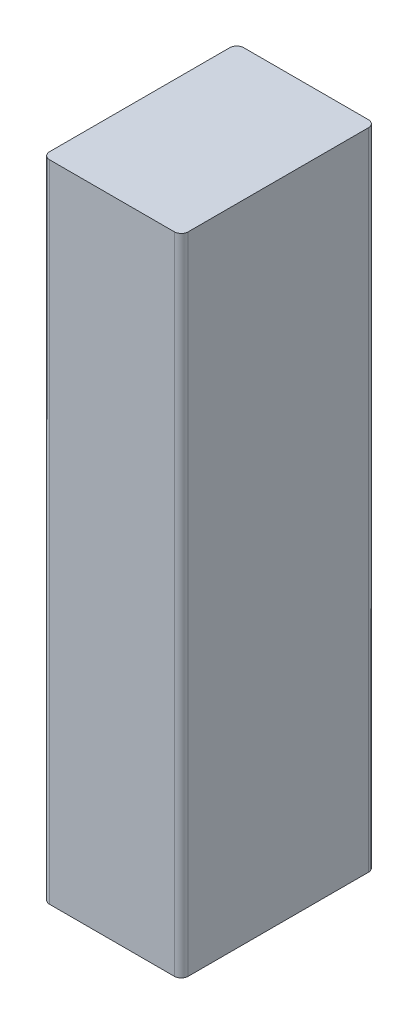
ISO-10303-21;
HEADER;
FILE_DESCRIPTION(('STEP AP214'),'2;1');
FILE_NAME('part.step','',(''),(''),'','','');
FILE_SCHEMA(('AUTOMOTIVE_DESIGN { 1 0 10303 214 1 1 1 1 }'));
ENDSEC;
DATA;
#1=APPLICATION_CONTEXT('core data for automotive mechanical design processes');
#2=APPLICATION_PROTOCOL_DEFINITION('international standard','automotive_design',2000,#1);
#3=PRODUCT_CONTEXT('',#1,'mechanical');
#4=PRODUCT('Part','Part','',(#3));
#5=PRODUCT_RELATED_PRODUCT_CATEGORY('part','',(#4));
#6=PRODUCT_DEFINITION_FORMATION('','',#4);
#7=PRODUCT_DEFINITION_CONTEXT('part definition',#1,'design');
#8=PRODUCT_DEFINITION('design','',#6,#7);
#9=PRODUCT_DEFINITION_SHAPE('','',#8);
#10=(LENGTH_UNIT() NAMED_UNIT(*) SI_UNIT(.MILLI.,.METRE.));
#11=(NAMED_UNIT(*) PLANE_ANGLE_UNIT() SI_UNIT($,.RADIAN.));
#12=(NAMED_UNIT(*) SI_UNIT($,.STERADIAN.) SOLID_ANGLE_UNIT());
#13=UNCERTAINTY_MEASURE_WITH_UNIT(LENGTH_MEASURE(1.E-05),#10,'distance_accuracy_value','');
#14=(GEOMETRIC_REPRESENTATION_CONTEXT(3) GLOBAL_UNCERTAINTY_ASSIGNED_CONTEXT((#13)) GLOBAL_UNIT_ASSIGNED_CONTEXT((#10,
#11,#12)) REPRESENTATION_CONTEXT('',''));
#15=CARTESIAN_POINT('',(0.,0.,0.));
#16=DIRECTION('',(0.,0.,1.));
#17=DIRECTION('',(1.,0.,0.));
#18=AXIS2_PLACEMENT_3D('',#15,#16,#17);
#19=CARTESIAN_POINT('',(32.1050185574376,93.,-17.1048630222315));
#20=DIRECTION('',(0.,-1.,0.));
#21=DIRECTION('',(0.,0.,-1.));
#22=AXIS2_PLACEMENT_3D('',#19,#20,#21);
#23=CYLINDRICAL_SURFACE('',#22,1.);
#24=CARTESIAN_POINT('',(32.1050185574376,0.,-17.1048630222315));
#25=DIRECTION('',(0.,1.,0.));
#26=DIRECTION('',(0.,0.,-1.));
#27=AXIS2_PLACEMENT_3D('',#24,#25,#26);
#28=CIRCLE('',#27,1.);
#29=CARTESIAN_POINT('',(32.1050185574376,0.,-18.1048630222315));
#30=VERTEX_POINT('',#29);
#31=CARTESIAN_POINT('',(31.1050185574376,0.,-17.1048630222315));
#32=VERTEX_POINT('',#31);
#33=EDGE_CURVE('E136',#30,#32,#28,.T.);
#34=ORIENTED_EDGE('',*,*,#33,.T.);
#35=DIRECTION('',(0.,-1.,0.));
#36=VECTOR('',#35,1.);
#37=CARTESIAN_POINT('',(31.1050185574376,93.,-17.1048630222315));
#38=LINE('',#37,#36);
#39=CARTESIAN_POINT('',(31.1050185574376,93.,-17.1048630222315));
#40=VERTEX_POINT('',#39);
#41=EDGE_CURVE('E11',#40,#32,#38,.T.);
#42=ORIENTED_EDGE('',*,*,#41,.F.);
#43=CARTESIAN_POINT('',(32.1050185574376,93.,-17.1048630222315));
#44=DIRECTION('',(0.,1.,0.));
#45=DIRECTION('',(0.,0.,-1.));
#46=AXIS2_PLACEMENT_3D('',#43,#44,#45);
#47=CIRCLE('',#46,1.);
#48=CARTESIAN_POINT('',(32.1050185574376,93.,-18.1048630222315));
#49=VERTEX_POINT('',#48);
#50=EDGE_CURVE('E150',#49,#40,#47,.T.);
#51=ORIENTED_EDGE('',*,*,#50,.F.);
#52=DIRECTION('',(0.,-1.,0.));
#53=VECTOR('',#52,1.);
#54=CARTESIAN_POINT('',(32.1050185574376,93.,-18.1048630222315));
#55=LINE('',#54,#53);
#56=EDGE_CURVE('E132',#49,#30,#55,.T.);
#57=ORIENTED_EDGE('',*,*,#56,.T.);
#58=EDGE_LOOP('',(#34,#42,#51,#57));
#59=FACE_BOUND('',#58,.T.);
#60=ADVANCED_FACE('F40',(#59),#23,.T.);
#61=CARTESIAN_POINT('',(31.1050185574376,93.,-17.1048630222315));
#62=DIRECTION('',(1.,0.,0.));
#63=DIRECTION('',(0.,0.,-1.));
#64=AXIS2_PLACEMENT_3D('',#61,#62,#63);
#65=PLANE('',#64);
#66=DIRECTION('',(0.,0.,1.));
#67=VECTOR('',#66,1.);
#68=CARTESIAN_POINT('',(31.1050185574376,0.,-17.1048630222315));
#69=LINE('',#68,#67);
#70=CARTESIAN_POINT('',(31.1050185574376,0.,8.89513697776848));
#71=VERTEX_POINT('',#70);
#72=EDGE_CURVE('E139',#32,#71,#69,.T.);
#73=ORIENTED_EDGE('',*,*,#72,.T.);
#74=DIRECTION('',(0.,-1.,0.));
#75=VECTOR('',#74,1.);
#76=CARTESIAN_POINT('',(31.1050185574376,93.,8.89513697776848));
#77=LINE('',#76,#75);
#78=CARTESIAN_POINT('',(31.1050185574376,93.,8.89513697776848));
#79=VERTEX_POINT('',#78);
#80=EDGE_CURVE('E48',#79,#71,#77,.T.);
#81=ORIENTED_EDGE('',*,*,#80,.F.);
#82=DIRECTION('',(0.,0.,1.));
#83=VECTOR('',#82,1.);
#84=CARTESIAN_POINT('',(31.1050185574376,93.,-17.1048630222315));
#85=LINE('',#84,#83);
#86=EDGE_CURVE('E99',#40,#79,#85,.T.);
#87=ORIENTED_EDGE('',*,*,#86,.F.);
#88=ORIENTED_EDGE('',*,*,#41,.T.);
#89=EDGE_LOOP('',(#73,#81,#87,#88));
#90=FACE_BOUND('',#89,.T.);
#91=ADVANCED_FACE('F185',(#90),#65,.F.);
#92=CARTESIAN_POINT('',(32.1050185574376,93.,8.89513697776849));
#93=DIRECTION('',(0.,-1.,0.));
#94=DIRECTION('',(0.,0.,-1.));
#95=AXIS2_PLACEMENT_3D('',#92,#93,#94);
#96=CYLINDRICAL_SURFACE('',#95,1.);
#97=CARTESIAN_POINT('',(32.1050185574376,0.,8.89513697776849));
#98=DIRECTION('',(0.,1.,0.));
#99=DIRECTION('',(0.,0.,1.));
#100=AXIS2_PLACEMENT_3D('',#97,#98,#99);
#101=CIRCLE('',#100,1.);
#102=CARTESIAN_POINT('',(32.1050185574376,0.,9.89513697776849));
#103=VERTEX_POINT('',#102);
#104=EDGE_CURVE('E141',#71,#103,#101,.T.);
#105=ORIENTED_EDGE('',*,*,#104,.T.);
#106=DIRECTION('',(0.,-1.,0.));
#107=VECTOR('',#106,1.);
#108=CARTESIAN_POINT('',(32.1050185574376,93.,9.89513697776849));
#109=LINE('',#108,#107);
#110=CARTESIAN_POINT('',(32.1050185574376,93.,9.89513697776849));
#111=VERTEX_POINT('',#110);
#112=EDGE_CURVE('E157',#111,#103,#109,.T.);
#113=ORIENTED_EDGE('',*,*,#112,.F.);
#114=CARTESIAN_POINT('',(32.1050185574376,93.,8.89513697776849));
#115=DIRECTION('',(0.,1.,0.));
#116=DIRECTION('',(0.,0.,1.));
#117=AXIS2_PLACEMENT_3D('',#114,#115,#116);
#118=CIRCLE('',#117,1.);
#119=EDGE_CURVE('E165',#79,#111,#118,.T.);
#120=ORIENTED_EDGE('',*,*,#119,.F.);
#121=ORIENTED_EDGE('',*,*,#80,.T.);
#122=EDGE_LOOP('',(#105,#113,#120,#121));
#123=FACE_BOUND('',#122,.T.);
#124=ADVANCED_FACE('F163',(#123),#96,.T.);
#125=CARTESIAN_POINT('',(32.1050185574376,93.,9.89513697776849));
#126=DIRECTION('',(0.,0.,-1.));
#127=DIRECTION('',(-1.,0.,0.));
#128=AXIS2_PLACEMENT_3D('',#125,#126,#127);
#129=PLANE('',#128);
#130=DIRECTION('',(1.,0.,0.));
#131=VECTOR('',#130,1.);
#132=CARTESIAN_POINT('',(32.1050185574376,0.,9.89513697776849));
#133=LINE('',#132,#131);
#134=CARTESIAN_POINT('',(50.1050185574375,0.,9.89513697776849));
#135=VERTEX_POINT('',#134);
#136=EDGE_CURVE('E143',#103,#135,#133,.T.);
#137=ORIENTED_EDGE('',*,*,#136,.T.);
#138=DIRECTION('',(0.,-1.,0.));
#139=VECTOR('',#138,1.);
#140=CARTESIAN_POINT('',(50.1050185574375,93.,9.89513697776849));
#141=LINE('',#140,#139);
#142=CARTESIAN_POINT('',(50.1050185574375,93.,9.89513697776849));
#143=VERTEX_POINT('',#142);
#144=EDGE_CURVE('E154',#143,#135,#141,.T.);
#145=ORIENTED_EDGE('',*,*,#144,.F.);
#146=DIRECTION('',(1.,0.,0.));
#147=VECTOR('',#146,1.);
#148=CARTESIAN_POINT('',(32.1050185574376,93.,9.89513697776849));
#149=LINE('',#148,#147);
#150=EDGE_CURVE('E177',#111,#143,#149,.T.);
#151=ORIENTED_EDGE('',*,*,#150,.F.);
#152=ORIENTED_EDGE('',*,*,#112,.T.);
#153=EDGE_LOOP('',(#137,#145,#151,#152));
#154=FACE_BOUND('',#153,.T.);
#155=ADVANCED_FACE('F173',(#154),#129,.F.);
#156=CARTESIAN_POINT('',(50.1050185574376,93.,8.89513697776849));
#157=DIRECTION('',(0.,-1.,0.));
#158=DIRECTION('',(0.,0.,-1.));
#159=AXIS2_PLACEMENT_3D('',#156,#157,#158);
#160=CYLINDRICAL_SURFACE('',#159,1.);
#161=CARTESIAN_POINT('',(50.1050185574376,0.,8.89513697776849));
#162=DIRECTION('',(0.,1.,0.));
#163=DIRECTION('',(0.,0.,1.));
#164=AXIS2_PLACEMENT_3D('',#161,#162,#163);
#165=CIRCLE('',#164,1.);
#166=CARTESIAN_POINT('',(51.1050185574376,0.,8.89513697776848));
#167=VERTEX_POINT('',#166);
#168=EDGE_CURVE('E145',#135,#167,#165,.T.);
#169=ORIENTED_EDGE('',*,*,#168,.T.);
#170=DIRECTION('',(0.,-1.,0.));
#171=VECTOR('',#170,1.);
#172=CARTESIAN_POINT('',(51.1050185574376,93.,8.89513697776848));
#173=LINE('',#172,#171);
#174=CARTESIAN_POINT('',(51.1050185574376,93.,8.89513697776848));
#175=VERTEX_POINT('',#174);
#176=EDGE_CURVE('E127',#175,#167,#173,.T.);
#177=ORIENTED_EDGE('',*,*,#176,.F.);
#178=CARTESIAN_POINT('',(50.1050185574376,93.,8.89513697776849));
#179=DIRECTION('',(0.,1.,0.));
#180=DIRECTION('',(0.,0.,1.));
#181=AXIS2_PLACEMENT_3D('',#178,#179,#180);
#182=CIRCLE('',#181,1.);
#183=EDGE_CURVE('E118',#143,#175,#182,.T.);
#184=ORIENTED_EDGE('',*,*,#183,.F.);
#185=ORIENTED_EDGE('',*,*,#144,.T.);
#186=EDGE_LOOP('',(#169,#177,#184,#185));
#187=FACE_BOUND('',#186,.T.);
#188=ADVANCED_FACE('F176',(#187),#160,.T.);
#189=CARTESIAN_POINT('',(51.1050185574376,93.,-17.1048630222315));
#190=DIRECTION('',(-1.,0.,0.));
#191=DIRECTION('',(0.,0.,1.));
#192=AXIS2_PLACEMENT_3D('',#189,#190,#191);
#193=PLANE('',#192);
#194=DIRECTION('',(0.,0.,-1.));
#195=VECTOR('',#194,1.);
#196=CARTESIAN_POINT('',(51.1050185574376,0.,-17.1048630222315));
#197=LINE('',#196,#195);
#198=CARTESIAN_POINT('',(51.1050185574376,0.,-17.1048630222315));
#199=VERTEX_POINT('',#198);
#200=EDGE_CURVE('E126',#167,#199,#197,.T.);
#201=ORIENTED_EDGE('',*,*,#200,.T.);
#202=DIRECTION('',(0.,-1.,0.));
#203=VECTOR('',#202,1.);
#204=CARTESIAN_POINT('',(51.1050185574376,93.,-17.1048630222315));
#205=LINE('',#204,#203);
#206=CARTESIAN_POINT('',(51.1050185574376,93.,-17.1048630222315));
#207=VERTEX_POINT('',#206);
#208=EDGE_CURVE('E123',#207,#199,#205,.T.);
#209=ORIENTED_EDGE('',*,*,#208,.F.);
#210=DIRECTION('',(0.,0.,-1.));
#211=VECTOR('',#210,1.);
#212=CARTESIAN_POINT('',(51.1050185574376,93.,-17.1048630222315));
#213=LINE('',#212,#211);
#214=EDGE_CURVE('E112',#175,#207,#213,.T.);
#215=ORIENTED_EDGE('',*,*,#214,.F.);
#216=ORIENTED_EDGE('',*,*,#176,.T.);
#217=EDGE_LOOP('',(#201,#209,#215,#216));
#218=FACE_BOUND('',#217,.T.);
#219=ADVANCED_FACE('F124',(#218),#193,.F.);
#220=CARTESIAN_POINT('',(50.1050185574376,93.,-17.1048630222315));
#221=DIRECTION('',(0.,-1.,0.));
#222=DIRECTION('',(0.,0.,-1.));
#223=AXIS2_PLACEMENT_3D('',#220,#221,#222);
#224=CYLINDRICAL_SURFACE('',#223,1.);
#225=CARTESIAN_POINT('',(50.1050185574376,0.,-17.1048630222315));
#226=DIRECTION('',(0.,1.,0.));
#227=DIRECTION('',(0.,0.,1.));
#228=AXIS2_PLACEMENT_3D('',#225,#226,#227);
#229=CIRCLE('',#228,1.);
#230=CARTESIAN_POINT('',(50.1050185574375,0.,-18.1048630222315));
#231=VERTEX_POINT('',#230);
#232=EDGE_CURVE('E85',#199,#231,#229,.T.);
#233=ORIENTED_EDGE('',*,*,#232,.T.);
#234=DIRECTION('',(0.,-1.,0.));
#235=VECTOR('',#234,1.);
#236=CARTESIAN_POINT('',(50.1050185574375,93.,-18.1048630222315));
#237=LINE('',#236,#235);
#238=CARTESIAN_POINT('',(50.1050185574375,93.,-18.1048630222315));
#239=VERTEX_POINT('',#238);
#240=EDGE_CURVE('E128',#239,#231,#237,.T.);
#241=ORIENTED_EDGE('',*,*,#240,.F.);
#242=CARTESIAN_POINT('',(50.1050185574376,93.,-17.1048630222315));
#243=DIRECTION('',(0.,1.,0.));
#244=DIRECTION('',(0.,0.,1.));
#245=AXIS2_PLACEMENT_3D('',#242,#243,#244);
#246=CIRCLE('',#245,1.);
#247=EDGE_CURVE('E116',#207,#239,#246,.T.);
#248=ORIENTED_EDGE('',*,*,#247,.F.);
#249=ORIENTED_EDGE('',*,*,#208,.T.);
#250=EDGE_LOOP('',(#233,#241,#248,#249));
#251=FACE_BOUND('',#250,.T.);
#252=ADVANCED_FACE('F130',(#251),#224,.T.);
#253=CARTESIAN_POINT('',(32.1050185574376,93.,-18.1048630222315));
#254=DIRECTION('',(0.,0.,1.));
#255=DIRECTION('',(1.,0.,0.));
#256=AXIS2_PLACEMENT_3D('',#253,#254,#255);
#257=PLANE('',#256);
#258=DIRECTION('',(-1.,0.,0.));
#259=VECTOR('',#258,1.);
#260=CARTESIAN_POINT('',(32.1050185574376,0.,-18.1048630222315));
#261=LINE('',#260,#259);
#262=EDGE_CURVE('E91',#231,#30,#261,.T.);
#263=ORIENTED_EDGE('',*,*,#262,.T.);
#264=ORIENTED_EDGE('',*,*,#56,.F.);
#265=DIRECTION('',(-1.,0.,0.));
#266=VECTOR('',#265,1.);
#267=CARTESIAN_POINT('',(32.1050185574376,93.,-18.1048630222315));
#268=LINE('',#267,#266);
#269=EDGE_CURVE('E56',#239,#49,#268,.T.);
#270=ORIENTED_EDGE('',*,*,#269,.F.);
#271=ORIENTED_EDGE('',*,*,#240,.T.);
#272=EDGE_LOOP('',(#263,#264,#270,#271));
#273=FACE_BOUND('',#272,.T.);
#274=ADVANCED_FACE('F201',(#273),#257,.F.);
#275=CARTESIAN_POINT('',(32.1050185574376,93.,-17.1048630222315));
#276=DIRECTION('',(0.,-1.,0.));
#277=DIRECTION('',(0.,0.,-1.));
#278=AXIS2_PLACEMENT_3D('',#275,#276,#277);
#279=PLANE('',#278);
#280=ORIENTED_EDGE('',*,*,#50,.T.);
#281=ORIENTED_EDGE('',*,*,#86,.T.);
#282=ORIENTED_EDGE('',*,*,#119,.T.);
#283=ORIENTED_EDGE('',*,*,#150,.T.);
#284=ORIENTED_EDGE('',*,*,#183,.T.);
#285=ORIENTED_EDGE('',*,*,#214,.T.);
#286=ORIENTED_EDGE('',*,*,#247,.T.);
#287=ORIENTED_EDGE('',*,*,#269,.T.);
#288=EDGE_LOOP('',(#280,#281,#282,#283,#284,#285,#286,#287));
#289=FACE_BOUND('',#288,.T.);
#290=ADVANCED_FACE('F114',(#289),#279,.F.);
#291=CARTESIAN_POINT('',(32.1050185574376,0.,-17.1048630222315));
#292=DIRECTION('',(0.,-1.,0.));
#293=DIRECTION('',(0.,0.,-1.));
#294=AXIS2_PLACEMENT_3D('',#291,#292,#293);
#295=PLANE('',#294);
#296=ORIENTED_EDGE('',*,*,#33,.F.);
#297=ORIENTED_EDGE('',*,*,#262,.F.);
#298=ORIENTED_EDGE('',*,*,#232,.F.);
#299=ORIENTED_EDGE('',*,*,#200,.F.);
#300=ORIENTED_EDGE('',*,*,#168,.F.);
#301=ORIENTED_EDGE('',*,*,#136,.F.);
#302=ORIENTED_EDGE('',*,*,#104,.F.);
#303=ORIENTED_EDGE('',*,*,#72,.F.);
#304=EDGE_LOOP('',(#296,#297,#298,#299,#300,#301,#302,#303));
#305=FACE_BOUND('',#304,.T.);
#306=ADVANCED_FACE('F169',(#305),#295,.T.);
#307=CLOSED_SHELL('',(#60,#91,#124,#155,#188,#219,#252,#274,#290,#306));
#308=MANIFOLD_SOLID_BREP('B2',#307);
#309=ADVANCED_BREP_SHAPE_REPRESENTATION('',(#18,#308),#14);
#310=SHAPE_DEFINITION_REPRESENTATION(#9,#309);
ENDSEC;
END-ISO-10303-21;
